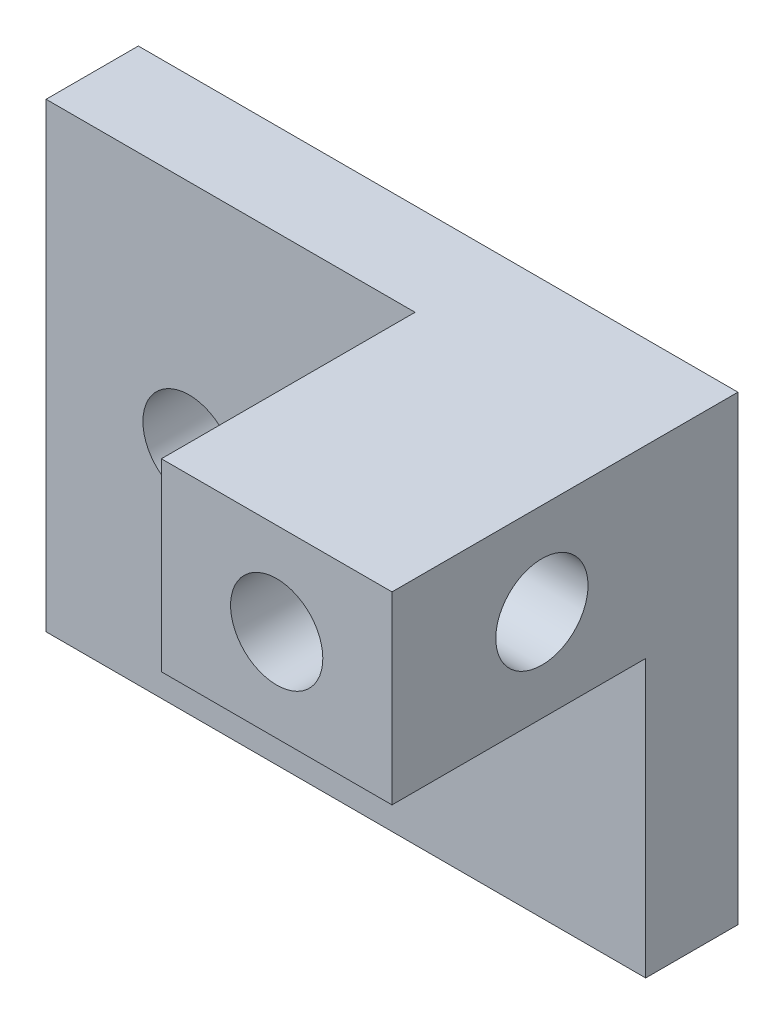
ISO-10303-21;
HEADER;
FILE_DESCRIPTION(('STEP AP214'),'2;1');
FILE_NAME('part.step','',(''),(''),'','','');
FILE_SCHEMA(('AUTOMOTIVE_DESIGN { 1 0 10303 214 1 1 1 1 }'));
ENDSEC;
DATA;
#1=APPLICATION_CONTEXT('core data for automotive mechanical design processes');
#2=APPLICATION_PROTOCOL_DEFINITION('international standard','automotive_design',2000,#1);
#3=PRODUCT_CONTEXT('',#1,'mechanical');
#4=PRODUCT('Part','Part','',(#3));
#5=PRODUCT_RELATED_PRODUCT_CATEGORY('part','',(#4));
#6=PRODUCT_DEFINITION_FORMATION('','',#4);
#7=PRODUCT_DEFINITION_CONTEXT('part definition',#1,'design');
#8=PRODUCT_DEFINITION('design','',#6,#7);
#9=PRODUCT_DEFINITION_SHAPE('','',#8);
#10=(LENGTH_UNIT() NAMED_UNIT(*) SI_UNIT(.MILLI.,.METRE.));
#11=(NAMED_UNIT(*) PLANE_ANGLE_UNIT() SI_UNIT($,.RADIAN.));
#12=(NAMED_UNIT(*) SI_UNIT($,.STERADIAN.) SOLID_ANGLE_UNIT());
#13=UNCERTAINTY_MEASURE_WITH_UNIT(LENGTH_MEASURE(1.E-05),#10,'distance_accuracy_value','');
#14=(GEOMETRIC_REPRESENTATION_CONTEXT(3) GLOBAL_UNCERTAINTY_ASSIGNED_CONTEXT((#13)) GLOBAL_UNIT_ASSIGNED_CONTEXT((#10,
#11,#12)) REPRESENTATION_CONTEXT('',''));
#15=CARTESIAN_POINT('',(0.,0.,0.));
#16=DIRECTION('',(0.,0.,1.));
#17=DIRECTION('',(1.,0.,0.));
#18=AXIS2_PLACEMENT_3D('',#15,#16,#17);
#19=CARTESIAN_POINT('',(15.,50.,75.));
#20=DIRECTION('',(1.,0.,0.));
#21=DIRECTION('',(0.,1.,0.));
#22=AXIS2_PLACEMENT_3D('',#19,#20,#21);
#23=PLANE('',#22);
#24=CARTESIAN_POINT('',(15.,30.,42.5));
#25=DIRECTION('',(-1.,0.,0.));
#26=DIRECTION('',(0.,-1.,0.));
#27=AXIS2_PLACEMENT_3D('',#24,#25,#26);
#28=CIRCLE('',#27,10.);
#29=CARTESIAN_POINT('',(15.,20.,42.5));
#30=VERTEX_POINT('',#29);
#31=EDGE_CURVE('E258',#30,#30,#28,.T.);
#32=ORIENTED_EDGE('',*,*,#31,.F.);
#33=EDGE_LOOP('',(#32));
#34=FACE_BOUND('',#33,.T.);
#35=DIRECTION('',(0.,-1.,0.));
#36=VECTOR('',#35,1.);
#37=CARTESIAN_POINT('',(15.,0.,20.));
#38=LINE('',#37,#36);
#39=CARTESIAN_POINT('',(15.,50.,20.));
#40=VERTEX_POINT('',#39);
#41=CARTESIAN_POINT('',(15.,9.99999999999999,20.));
#42=VERTEX_POINT('',#41);
#43=EDGE_CURVE('E68',#40,#42,#38,.T.);
#44=ORIENTED_EDGE('',*,*,#43,.T.);
#45=DIRECTION('',(0.,0.,-1.));
#46=VECTOR('',#45,1.);
#47=CARTESIAN_POINT('',(15.,9.99999999999999,75.));
#48=LINE('',#47,#46);
#49=CARTESIAN_POINT('',(15.,9.99999999999999,75.));
#50=VERTEX_POINT('',#49);
#51=EDGE_CURVE('E114',#50,#42,#48,.T.);
#52=ORIENTED_EDGE('',*,*,#51,.F.);
#53=DIRECTION('',(0.,-1.,0.));
#54=VECTOR('',#53,1.);
#55=CARTESIAN_POINT('',(15.,50.,75.));
#56=LINE('',#55,#54);
#57=CARTESIAN_POINT('',(15.,50.,75.));
#58=VERTEX_POINT('',#57);
#59=EDGE_CURVE('E235',#58,#50,#56,.T.);
#60=ORIENTED_EDGE('',*,*,#59,.F.);
#61=DIRECTION('',(0.,0.,-1.));
#62=VECTOR('',#61,1.);
#63=CARTESIAN_POINT('',(15.,50.,75.));
#64=LINE('',#63,#62);
#65=EDGE_CURVE('E117',#58,#40,#64,.T.);
#66=ORIENTED_EDGE('',*,*,#65,.T.);
#67=EDGE_LOOP('',(#44,#52,#60,#66));
#68=FACE_BOUND('',#67,.T.);
#69=ADVANCED_FACE('F47',(#34,#68),#23,.F.);
#70=CARTESIAN_POINT('',(65.,9.99999999999999,75.));
#71=DIRECTION('',(0.,1.,0.));
#72=DIRECTION('',(-1.,0.,0.));
#73=AXIS2_PLACEMENT_3D('',#70,#71,#72);
#74=PLANE('',#73);
#75=ORIENTED_EDGE('',*,*,#51,.T.);
#76=DIRECTION('',(1.,0.,0.));
#77=VECTOR('',#76,1.);
#78=CARTESIAN_POINT('',(0.,9.99999999999999,20.));
#79=LINE('',#78,#77);
#80=CARTESIAN_POINT('',(65.,9.99999999999999,20.));
#81=VERTEX_POINT('',#80);
#82=EDGE_CURVE('E119',#42,#81,#79,.T.);
#83=ORIENTED_EDGE('',*,*,#82,.T.);
#84=DIRECTION('',(0.,0.,-1.));
#85=VECTOR('',#84,1.);
#86=CARTESIAN_POINT('',(65.,9.99999999999999,75.));
#87=LINE('',#86,#85);
#88=CARTESIAN_POINT('',(65.,9.99999999999999,75.));
#89=VERTEX_POINT('',#88);
#90=EDGE_CURVE('E132',#89,#81,#87,.T.);
#91=ORIENTED_EDGE('',*,*,#90,.F.);
#92=DIRECTION('',(1.,0.,0.));
#93=VECTOR('',#92,1.);
#94=CARTESIAN_POINT('',(65.,9.99999999999999,75.));
#95=LINE('',#94,#93);
#96=EDGE_CURVE('E131',#50,#89,#95,.T.);
#97=ORIENTED_EDGE('',*,*,#96,.F.);
#98=EDGE_LOOP('',(#75,#83,#91,#97));
#99=FACE_BOUND('',#98,.T.);
#100=ADVANCED_FACE('F130',(#99),#74,.F.);
#101=CARTESIAN_POINT('',(65.,30.,42.5));
#102=DIRECTION('',(-1.,0.,0.));
#103=DIRECTION('',(0.,-1.,0.));
#104=AXIS2_PLACEMENT_3D('',#101,#102,#103);
#105=CYLINDRICAL_SURFACE('',#104,10.);
#106=ORIENTED_EDGE('',*,*,#31,.T.);
#107=EDGE_LOOP('',(#106));
#108=FACE_BOUND('',#107,.T.);
#109=CARTESIAN_POINT('',(40.,30.,42.5));
#110=DIRECTION('',(-0.707106781186547,0.,-0.707106781186547));
#111=DIRECTION('',(-0.707106781186547,0.,0.707106781186547));
#112=AXIS2_PLACEMENT_3D('',#109,#110,#111);
#113=ELLIPSE('',#112,14.142135623731,10.);
#114=CARTESIAN_POINT('',(40.,40.,42.5));
#115=VERTEX_POINT('',#114);
#116=CARTESIAN_POINT('',(40.,20.,42.5));
#117=VERTEX_POINT('',#116);
#118=EDGE_CURVE('E60',#115,#117,#113,.F.);
#119=ORIENTED_EDGE('',*,*,#118,.T.);
#120=CARTESIAN_POINT('',(40.,30.,42.5));
#121=DIRECTION('',(-0.707106781186547,0.,0.707106781186547));
#122=DIRECTION('',(-0.707106781186547,0.,-0.707106781186547));
#123=AXIS2_PLACEMENT_3D('',#120,#121,#122);
#124=ELLIPSE('',#123,14.142135623731,10.);
#125=EDGE_CURVE('E13',#117,#115,#124,.F.);
#126=ORIENTED_EDGE('',*,*,#125,.T.);
#127=EDGE_LOOP('',(#119,#126));
#128=FACE_BOUND('',#127,.T.);
#129=ADVANCED_FACE('F176',(#108,#128),#105,.F.);
#130=CARTESIAN_POINT('',(0.,0.,20.));
#131=DIRECTION('',(0.,0.,-1.));
#132=DIRECTION('',(-1.,0.,0.));
#133=AXIS2_PLACEMENT_3D('',#130,#131,#132);
#134=PLANE('',#133);
#135=ORIENTED_EDGE('',*,*,#82,.F.);
#136=ORIENTED_EDGE('',*,*,#43,.F.);
#137=DIRECTION('',(-1.,0.,0.));
#138=VECTOR('',#137,1.);
#139=CARTESIAN_POINT('',(-65.,50.,20.));
#140=LINE('',#139,#138);
#141=CARTESIAN_POINT('',(-65.,50.,20.));
#142=VERTEX_POINT('',#141);
#143=EDGE_CURVE('E139',#40,#142,#140,.T.);
#144=ORIENTED_EDGE('',*,*,#143,.T.);
#145=DIRECTION('',(0.,-1.,0.));
#146=VECTOR('',#145,1.);
#147=CARTESIAN_POINT('',(-65.,-50.,20.));
#148=LINE('',#147,#146);
#149=CARTESIAN_POINT('',(-65.,-50.,20.));
#150=VERTEX_POINT('',#149);
#151=EDGE_CURVE('E142',#142,#150,#148,.T.);
#152=ORIENTED_EDGE('',*,*,#151,.T.);
#153=DIRECTION('',(1.,0.,0.));
#154=VECTOR('',#153,1.);
#155=CARTESIAN_POINT('',(-65.,-50.,20.));
#156=LINE('',#155,#154);
#157=CARTESIAN_POINT('',(65.,-50.,20.));
#158=VERTEX_POINT('',#157);
#159=EDGE_CURVE('E144',#150,#158,#156,.T.);
#160=ORIENTED_EDGE('',*,*,#159,.T.);
#161=DIRECTION('',(0.,1.,0.));
#162=VECTOR('',#161,1.);
#163=CARTESIAN_POINT('',(65.,-50.,20.));
#164=LINE('',#163,#162);
#165=EDGE_CURVE('E125',#158,#81,#164,.T.);
#166=ORIENTED_EDGE('',*,*,#165,.T.);
#167=EDGE_LOOP('',(#135,#136,#144,#152,#160,#166));
#168=FACE_BOUND('',#167,.T.);
#169=CARTESIAN_POINT('',(-34.,0.,20.));
#170=DIRECTION('',(0.,0.,-1.));
#171=DIRECTION('',(-1.,0.,0.));
#172=AXIS2_PLACEMENT_3D('',#169,#170,#171);
#173=CIRCLE('',#172,10.);
#174=CARTESIAN_POINT('',(-44.,0.,20.));
#175=VERTEX_POINT('',#174);
#176=EDGE_CURVE('E255',#175,#175,#173,.T.);
#177=ORIENTED_EDGE('',*,*,#176,.T.);
#178=EDGE_LOOP('',(#177));
#179=FACE_BOUND('',#178,.T.);
#180=ADVANCED_FACE('F122',(#168,#179),#134,.F.);
#181=CARTESIAN_POINT('',(65.,-50.,20.));
#182=DIRECTION('',(-1.,0.,0.));
#183=DIRECTION('',(0.,0.,1.));
#184=AXIS2_PLACEMENT_3D('',#181,#182,#183);
#185=PLANE('',#184);
#186=CARTESIAN_POINT('',(65.,30.,42.5));
#187=DIRECTION('',(-1.,0.,0.));
#188=DIRECTION('',(0.,-1.,0.));
#189=AXIS2_PLACEMENT_3D('',#186,#187,#188);
#190=CIRCLE('',#189,10.);
#191=CARTESIAN_POINT('',(65.,20.,42.5));
#192=VERTEX_POINT('',#191);
#193=EDGE_CURVE('E238',#192,#192,#190,.T.);
#194=ORIENTED_EDGE('',*,*,#193,.T.);
#195=EDGE_LOOP('',(#194));
#196=FACE_BOUND('',#195,.T.);
#197=DIRECTION('',(0.,0.,-1.));
#198=VECTOR('',#197,1.);
#199=CARTESIAN_POINT('',(65.,50.,20.));
#200=LINE('',#199,#198);
#201=CARTESIAN_POINT('',(65.,50.,75.));
#202=VERTEX_POINT('',#201);
#203=CARTESIAN_POINT('',(65.,50.,0.));
#204=VERTEX_POINT('',#203);
#205=EDGE_CURVE('E162',#202,#204,#200,.T.);
#206=ORIENTED_EDGE('',*,*,#205,.F.);
#207=DIRECTION('',(0.,1.,0.));
#208=VECTOR('',#207,1.);
#209=CARTESIAN_POINT('',(65.,50.,75.));
#210=LINE('',#209,#208);
#211=EDGE_CURVE('E230',#89,#202,#210,.T.);
#212=ORIENTED_EDGE('',*,*,#211,.F.);
#213=ORIENTED_EDGE('',*,*,#90,.T.);
#214=ORIENTED_EDGE('',*,*,#165,.F.);
#215=DIRECTION('',(0.,0.,-1.));
#216=VECTOR('',#215,1.);
#217=CARTESIAN_POINT('',(65.,-50.,20.));
#218=LINE('',#217,#216);
#219=CARTESIAN_POINT('',(65.,-50.,0.));
#220=VERTEX_POINT('',#219);
#221=EDGE_CURVE('E146',#158,#220,#218,.T.);
#222=ORIENTED_EDGE('',*,*,#221,.T.);
#223=DIRECTION('',(0.,1.,0.));
#224=VECTOR('',#223,1.);
#225=CARTESIAN_POINT('',(65.,-50.,0.));
#226=LINE('',#225,#224);
#227=EDGE_CURVE('E118',#220,#204,#226,.T.);
#228=ORIENTED_EDGE('',*,*,#227,.T.);
#229=EDGE_LOOP('',(#206,#212,#213,#214,#222,#228));
#230=FACE_BOUND('',#229,.T.);
#231=ADVANCED_FACE('F49',(#196,#230),#185,.F.);
#232=CARTESIAN_POINT('',(-65.,50.,20.));
#233=DIRECTION('',(0.,-1.,0.));
#234=DIRECTION('',(0.,0.,-1.));
#235=AXIS2_PLACEMENT_3D('',#232,#233,#234);
#236=PLANE('',#235);
#237=ORIENTED_EDGE('',*,*,#143,.F.);
#238=ORIENTED_EDGE('',*,*,#65,.F.);
#239=DIRECTION('',(-1.,0.,0.));
#240=VECTOR('',#239,1.);
#241=CARTESIAN_POINT('',(65.,50.,75.));
#242=LINE('',#241,#240);
#243=EDGE_CURVE('E232',#202,#58,#242,.T.);
#244=ORIENTED_EDGE('',*,*,#243,.F.);
#245=ORIENTED_EDGE('',*,*,#205,.T.);
#246=DIRECTION('',(-1.,0.,0.));
#247=VECTOR('',#246,1.);
#248=CARTESIAN_POINT('',(-65.,50.,0.));
#249=LINE('',#248,#247);
#250=CARTESIAN_POINT('',(-65.,50.,0.));
#251=VERTEX_POINT('',#250);
#252=EDGE_CURVE('E149',#204,#251,#249,.T.);
#253=ORIENTED_EDGE('',*,*,#252,.T.);
#254=DIRECTION('',(0.,0.,-1.));
#255=VECTOR('',#254,1.);
#256=CARTESIAN_POINT('',(-65.,50.,20.));
#257=LINE('',#256,#255);
#258=EDGE_CURVE('E159',#142,#251,#257,.T.);
#259=ORIENTED_EDGE('',*,*,#258,.F.);
#260=EDGE_LOOP('',(#237,#238,#244,#245,#253,#259));
#261=FACE_BOUND('',#260,.T.);
#262=ADVANCED_FACE('F210',(#261),#236,.F.);
#263=CARTESIAN_POINT('',(-65.,-50.,20.));
#264=DIRECTION('',(1.,0.,0.));
#265=DIRECTION('',(0.,0.,-1.));
#266=AXIS2_PLACEMENT_3D('',#263,#264,#265);
#267=PLANE('',#266);
#268=DIRECTION('',(0.,-1.,0.));
#269=VECTOR('',#268,1.);
#270=CARTESIAN_POINT('',(-65.,-50.,0.));
#271=LINE('',#270,#269);
#272=CARTESIAN_POINT('',(-65.,-50.,0.));
#273=VERTEX_POINT('',#272);
#274=EDGE_CURVE('E151',#251,#273,#271,.T.);
#275=ORIENTED_EDGE('',*,*,#274,.T.);
#276=DIRECTION('',(0.,0.,-1.));
#277=VECTOR('',#276,1.);
#278=CARTESIAN_POINT('',(-65.,-50.,20.));
#279=LINE('',#278,#277);
#280=EDGE_CURVE('E156',#150,#273,#279,.T.);
#281=ORIENTED_EDGE('',*,*,#280,.F.);
#282=ORIENTED_EDGE('',*,*,#151,.F.);
#283=ORIENTED_EDGE('',*,*,#258,.T.);
#284=EDGE_LOOP('',(#275,#281,#282,#283));
#285=FACE_BOUND('',#284,.T.);
#286=ADVANCED_FACE('F207',(#285),#267,.F.);
#287=CARTESIAN_POINT('',(-65.,-50.,20.));
#288=DIRECTION('',(0.,1.,0.));
#289=DIRECTION('',(0.,0.,1.));
#290=AXIS2_PLACEMENT_3D('',#287,#288,#289);
#291=PLANE('',#290);
#292=DIRECTION('',(1.,0.,0.));
#293=VECTOR('',#292,1.);
#294=CARTESIAN_POINT('',(-65.,-50.,0.));
#295=LINE('',#294,#293);
#296=EDGE_CURVE('E140',#273,#220,#295,.T.);
#297=ORIENTED_EDGE('',*,*,#296,.T.);
#298=ORIENTED_EDGE('',*,*,#221,.F.);
#299=ORIENTED_EDGE('',*,*,#159,.F.);
#300=ORIENTED_EDGE('',*,*,#280,.T.);
#301=EDGE_LOOP('',(#297,#298,#299,#300));
#302=FACE_BOUND('',#301,.T.);
#303=ADVANCED_FACE('F203',(#302),#291,.F.);
#304=CARTESIAN_POINT('',(0.,0.,0.));
#305=DIRECTION('',(0.,0.,-1.));
#306=DIRECTION('',(-1.,0.,0.));
#307=AXIS2_PLACEMENT_3D('',#304,#305,#306);
#308=PLANE('',#307);
#309=CARTESIAN_POINT('',(40.,30.,0.));
#310=DIRECTION('',(0.,0.,1.));
#311=DIRECTION('',(1.,0.,0.));
#312=AXIS2_PLACEMENT_3D('',#309,#310,#311);
#313=CIRCLE('',#312,10.);
#314=CARTESIAN_POINT('',(50.,30.,0.));
#315=VERTEX_POINT('',#314);
#316=EDGE_CURVE('E254',#315,#315,#313,.T.);
#317=ORIENTED_EDGE('',*,*,#316,.T.);
#318=EDGE_LOOP('',(#317));
#319=FACE_BOUND('',#318,.T.);
#320=CARTESIAN_POINT('',(-34.,0.,0.));
#321=DIRECTION('',(0.,0.,1.));
#322=DIRECTION('',(1.,0.,0.));
#323=AXIS2_PLACEMENT_3D('',#320,#321,#322);
#324=CIRCLE('',#323,10.);
#325=CARTESIAN_POINT('',(-24.,0.,0.));
#326=VERTEX_POINT('',#325);
#327=EDGE_CURVE('E233',#326,#326,#324,.T.);
#328=ORIENTED_EDGE('',*,*,#327,.T.);
#329=EDGE_LOOP('',(#328));
#330=FACE_BOUND('',#329,.T.);
#331=ORIENTED_EDGE('',*,*,#227,.F.);
#332=ORIENTED_EDGE('',*,*,#296,.F.);
#333=ORIENTED_EDGE('',*,*,#274,.F.);
#334=ORIENTED_EDGE('',*,*,#252,.F.);
#335=EDGE_LOOP('',(#331,#332,#333,#334));
#336=FACE_BOUND('',#335,.T.);
#337=ADVANCED_FACE('F199',(#319,#330,#336),#308,.T.);
#338=CARTESIAN_POINT('',(0.,0.,75.));
#339=DIRECTION('',(0.,0.,-1.));
#340=DIRECTION('',(-1.,0.,0.));
#341=AXIS2_PLACEMENT_3D('',#338,#339,#340);
#342=PLANE('',#341);
#343=CARTESIAN_POINT('',(40.,30.,75.));
#344=DIRECTION('',(0.,0.,1.));
#345=DIRECTION('',(1.,0.,0.));
#346=AXIS2_PLACEMENT_3D('',#343,#344,#345);
#347=CIRCLE('',#346,10.);
#348=CARTESIAN_POINT('',(50.,30.,75.));
#349=VERTEX_POINT('',#348);
#350=EDGE_CURVE('E252',#349,#349,#347,.T.);
#351=ORIENTED_EDGE('',*,*,#350,.F.);
#352=EDGE_LOOP('',(#351));
#353=FACE_BOUND('',#352,.T.);
#354=ORIENTED_EDGE('',*,*,#211,.T.);
#355=ORIENTED_EDGE('',*,*,#243,.T.);
#356=ORIENTED_EDGE('',*,*,#59,.T.);
#357=ORIENTED_EDGE('',*,*,#96,.T.);
#358=EDGE_LOOP('',(#354,#355,#356,#357));
#359=FACE_BOUND('',#358,.T.);
#360=ADVANCED_FACE('F202',(#353,#359),#342,.F.);
#361=CARTESIAN_POINT('',(-34.,0.,0.));
#362=DIRECTION('',(0.,0.,1.));
#363=DIRECTION('',(1.,0.,0.));
#364=AXIS2_PLACEMENT_3D('',#361,#362,#363);
#365=CYLINDRICAL_SURFACE('',#364,10.);
#366=ORIENTED_EDGE('',*,*,#327,.F.);
#367=EDGE_LOOP('',(#366));
#368=FACE_BOUND('',#367,.T.);
#369=ORIENTED_EDGE('',*,*,#176,.F.);
#370=EDGE_LOOP('',(#369));
#371=FACE_BOUND('',#370,.T.);
#372=ADVANCED_FACE('F190',(#368,#371),#365,.F.);
#373=CARTESIAN_POINT('',(40.,30.,42.5));
#374=DIRECTION('',(-0.707106781186547,0.,-0.707106781186547));
#375=DIRECTION('',(-0.707106781186547,0.,0.707106781186547));
#376=AXIS2_PLACEMENT_3D('',#373,#374,#375);
#377=ELLIPSE('',#376,14.142135623731,10.);
#378=EDGE_CURVE('E165',#115,#117,#377,.T.);
#379=ORIENTED_EDGE('',*,*,#378,.T.);
#380=CARTESIAN_POINT('',(40.,30.,42.5));
#381=DIRECTION('',(-0.707106781186547,0.,0.707106781186547));
#382=DIRECTION('',(-0.707106781186547,0.,-0.707106781186547));
#383=AXIS2_PLACEMENT_3D('',#380,#381,#382);
#384=ELLIPSE('',#383,14.142135623731,10.);
#385=EDGE_CURVE('E55',#117,#115,#384,.T.);
#386=ORIENTED_EDGE('',*,*,#385,.T.);
#387=EDGE_LOOP('',(#379,#386));
#388=FACE_BOUND('',#387,.T.);
#389=ORIENTED_EDGE('',*,*,#193,.F.);
#390=EDGE_LOOP('',(#389));
#391=FACE_BOUND('',#390,.T.);
#392=ADVANCED_FACE('F169',(#388,#391),#105,.F.);
#393=CARTESIAN_POINT('',(40.,30.,0.));
#394=DIRECTION('',(0.,0.,1.));
#395=DIRECTION('',(1.,0.,0.));
#396=AXIS2_PLACEMENT_3D('',#393,#394,#395);
#397=CYLINDRICAL_SURFACE('',#396,10.);
#398=ORIENTED_EDGE('',*,*,#350,.T.);
#399=EDGE_LOOP('',(#398));
#400=FACE_BOUND('',#399,.T.);
#401=ORIENTED_EDGE('',*,*,#118,.F.);
#402=ORIENTED_EDGE('',*,*,#385,.F.);
#403=EDGE_LOOP('',(#401,#402));
#404=FACE_BOUND('',#403,.T.);
#405=ADVANCED_FACE('F173',(#400,#404),#397,.F.);
#406=ORIENTED_EDGE('',*,*,#316,.F.);
#407=EDGE_LOOP('',(#406));
#408=FACE_BOUND('',#407,.T.);
#409=ORIENTED_EDGE('',*,*,#378,.F.);
#410=ORIENTED_EDGE('',*,*,#125,.F.);
#411=EDGE_LOOP('',(#409,#410));
#412=FACE_BOUND('',#411,.T.);
#413=ADVANCED_FACE('F175',(#408,#412),#397,.F.);
#414=CLOSED_SHELL('',(#69,#100,#129,#180,#231,#262,#286,#303,#337,#360,#372,#392,#405,#413));
#415=MANIFOLD_SOLID_BREP('B2',#414);
#416=ADVANCED_BREP_SHAPE_REPRESENTATION('',(#18,#415),#14);
#417=SHAPE_DEFINITION_REPRESENTATION(#9,#416);
ENDSEC;
END-ISO-10303-21;
